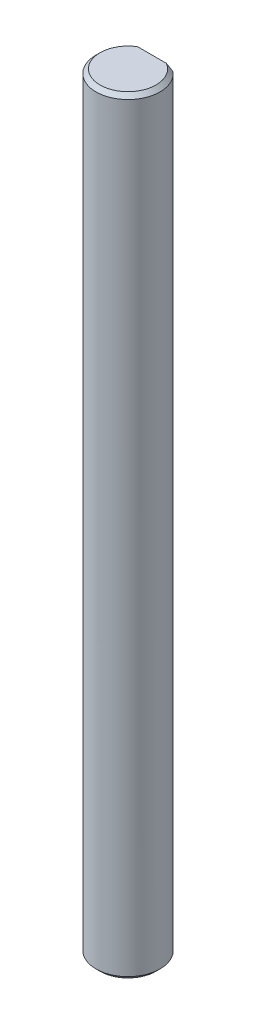
ISO-10303-21;
HEADER;
FILE_DESCRIPTION(('STEP AP214'),'2;1');
FILE_NAME('part.step','',(''),(''),'','','');
FILE_SCHEMA(('AUTOMOTIVE_DESIGN { 1 0 10303 214 1 1 1 1 }'));
ENDSEC;
DATA;
#1=APPLICATION_CONTEXT('core data for automotive mechanical design processes');
#2=APPLICATION_PROTOCOL_DEFINITION('international standard','automotive_design',2000,#1);
#3=PRODUCT_CONTEXT('',#1,'mechanical');
#4=PRODUCT('Part','Part','',(#3));
#5=PRODUCT_RELATED_PRODUCT_CATEGORY('part','',(#4));
#6=PRODUCT_DEFINITION_FORMATION('','',#4);
#7=PRODUCT_DEFINITION_CONTEXT('part definition',#1,'design');
#8=PRODUCT_DEFINITION('design','',#6,#7);
#9=PRODUCT_DEFINITION_SHAPE('','',#8);
#10=(LENGTH_UNIT() NAMED_UNIT(*) SI_UNIT(.MILLI.,.METRE.));
#11=(NAMED_UNIT(*) PLANE_ANGLE_UNIT() SI_UNIT($,.RADIAN.));
#12=(NAMED_UNIT(*) SI_UNIT($,.STERADIAN.) SOLID_ANGLE_UNIT());
#13=UNCERTAINTY_MEASURE_WITH_UNIT(LENGTH_MEASURE(1.E-05),#10,'distance_accuracy_value','');
#14=(GEOMETRIC_REPRESENTATION_CONTEXT(3) GLOBAL_UNCERTAINTY_ASSIGNED_CONTEXT((#13)) GLOBAL_UNIT_ASSIGNED_CONTEXT((#10,
#11,#12)) REPRESENTATION_CONTEXT('',''));
#15=CARTESIAN_POINT('',(0.,0.,0.));
#16=DIRECTION('',(0.,0.,1.));
#17=DIRECTION('',(1.,0.,0.));
#18=AXIS2_PLACEMENT_3D('',#15,#16,#17);
#19=CARTESIAN_POINT('',(0.,96.,0.));
#20=DIRECTION('',(0.,1.,0.));
#21=DIRECTION('',(0.,0.,1.));
#22=AXIS2_PLACEMENT_3D('',#19,#20,#21);
#23=PLANE('',#22);
#24=DIRECTION('',(1.,0.,0.));
#25=VECTOR('',#24,1.);
#26=CARTESIAN_POINT('',(0.,96.,-3.));
#27=LINE('',#26,#25);
#28=CARTESIAN_POINT('',(1.80277563783922,96.0000000000362,-3.));
#29=VERTEX_POINT('',#28);
#30=CARTESIAN_POINT('',(-1.80277563790592,96.0000000000018,-3.));
#31=VERTEX_POINT('',#30);
#32=EDGE_CURVE('E188',#29,#31,#27,.F.);
#33=ORIENTED_EDGE('',*,*,#32,.T.);
#34=CARTESIAN_POINT('',(0.,96.0000000000036,0.));
#35=DIRECTION('',(0.,-1.,0.));
#36=DIRECTION('',(1.,0.,0.));
#37=AXIS2_PLACEMENT_3D('',#34,#35,#36);
#38=CIRCLE('',#37,3.50000000008776);
#39=EDGE_CURVE('E149',#29,#31,#38,.T.);
#40=ORIENTED_EDGE('',*,*,#39,.F.);
#41=EDGE_LOOP('',(#33,#40));
#42=FACE_BOUND('',#41,.T.);
#43=ADVANCED_FACE('F17',(#42),#23,.T.);
#44=CARTESIAN_POINT('',(2.5,21.,-3.));
#45=DIRECTION('',(1.,0.,0.));
#46=DIRECTION('',(0.,0.,-1.));
#47=AXIS2_PLACEMENT_3D('',#44,#45,#46);
#48=PLANE('',#47);
#49=DIRECTION('',(0.,1.,0.));
#50=VECTOR('',#49,1.);
#51=CARTESIAN_POINT('',(2.5,21.,-3.));
#52=LINE('',#51,#50);
#53=CARTESIAN_POINT('',(2.50000000000947,0.405124837925426,-3.00000000001008));
#54=VERTEX_POINT('',#53);
#55=CARTESIAN_POINT('',(2.5,21.,-3.));
#56=VERTEX_POINT('',#55);
#57=EDGE_CURVE('E84',#54,#56,#52,.T.);
#58=ORIENTED_EDGE('',*,*,#57,.T.);
#59=DIRECTION('',(0.,0.,-1.));
#60=VECTOR('',#59,1.);
#61=CARTESIAN_POINT('',(2.5,21.,-3.));
#62=LINE('',#61,#60);
#63=CARTESIAN_POINT('',(2.5,21.,-3.1224989991992));
#64=VERTEX_POINT('',#63);
#65=EDGE_CURVE('E89',#64,#56,#62,.F.);
#66=ORIENTED_EDGE('',*,*,#65,.F.);
#67=DIRECTION('',(0.,-1.,0.));
#68=VECTOR('',#67,1.);
#69=CARTESIAN_POINT('',(2.5,96.,-3.1224989991992));
#70=LINE('',#69,#68);
#71=CARTESIAN_POINT('',(2.5,0.499999999990403,-3.1224989992067));
#72=VERTEX_POINT('',#71);
#73=EDGE_CURVE('E87',#72,#64,#70,.F.);
#74=ORIENTED_EDGE('',*,*,#73,.F.);
#75=CARTESIAN_POINT('',(2.5,0.405124837927105,-3.00000000002016));
#76=CARTESIAN_POINT('',(2.5,0.420858232889406,-3.02047778892625));
#77=CARTESIAN_POINT('',(2.5,0.436631194233203,-3.04092493377091));
#78=CARTESIAN_POINT('',(2.5,0.468256248258232,-3.08175793349673));
#79=CARTESIAN_POINT('',(2.5,0.484108340932331,-3.10214378838342));
#80=CARTESIAN_POINT('',(2.5,0.499999999980791,-3.1224989992142));
#81=B_SPLINE_CURVE_WITH_KNOTS('',3,(#75,#76,#77,#78,#79,#80),.UNSPECIFIED.,.F.,.F.,(4,2,4),(0.,
0.0774715972254449,0.154943187466547),.UNSPECIFIED.);
#82=EDGE_CURVE('E20',#54,#72,#81,.T.);
#83=ORIENTED_EDGE('',*,*,#82,.F.);
#84=EDGE_LOOP('',(#58,#66,#74,#83));
#85=FACE_BOUND('',#84,.T.);
#86=ADVANCED_FACE('F81',(#85),#48,.F.);
#87=CARTESIAN_POINT('',(-2.5,21.,-3.));
#88=DIRECTION('',(0.,0.,1.));
#89=DIRECTION('',(1.,0.,0.));
#90=AXIS2_PLACEMENT_3D('',#87,#88,#89);
#91=PLANE('',#90);
#92=DIRECTION('',(1.,0.,0.));
#93=VECTOR('',#92,1.);
#94=CARTESIAN_POINT('',(0.,0.,-3.));
#95=LINE('',#94,#93);
#96=CARTESIAN_POINT('',(1.80277563783862,-3.28457455383862E-11,-3.));
#97=VERTEX_POINT('',#96);
#98=CARTESIAN_POINT('',(-1.80277563783862,-3.28458455436605E-11,-3.));
#99=VERTEX_POINT('',#98);
#100=EDGE_CURVE('E98',#97,#99,#95,.F.);
#101=ORIENTED_EDGE('',*,*,#100,.T.);
#102=CARTESIAN_POINT('',(-2.5000000348508,0.405124847572636,-3.00000001958216));
#103=CARTESIAN_POINT('',(-2.44337206247022,0.368876916122266,-3.00000000706963));
#104=CARTESIAN_POINT('',(-2.38641513585717,0.333136548722232,-3.0000000019029));
#105=CARTESIAN_POINT('',(-2.27181042214399,0.26285353526736,-2.99999999809814));
#106=CARTESIAN_POINT('',(-2.21416302825434,0.228310247418162,-2.99999999945657));
#107=CARTESIAN_POINT('',(-2.09807747587407,0.160560990014678,-3.00000000054348));
#108=CARTESIAN_POINT('',(-2.03963924429478,0.127355145209297,-3.00000000027181));
#109=CARTESIAN_POINT('',(-1.92187925818233,0.062473006645769,-2.99999999972804));
#110=CARTESIAN_POINT('',(-1.86255703916131,0.0307975569775499,-2.99999999945593));
#111=CARTESIAN_POINT('',(-1.80277563777516,-6.55353125076226E-11,-3.));
#112=B_SPLINE_CURVE_WITH_KNOTS('',3,(#102,#103,#104,#105,#106,#107,#108,#109,#110,#111),
.UNSPECIFIED.,.F.,.F.,(4,2,2,2,4),(0.,0.201709286514318,0.403308702042758,0.604926878250095,
0.806655016410291),.UNSPECIFIED.);
#113=CARTESIAN_POINT('',(-2.50000001455334,0.405124847228437,-3.));
#114=VERTEX_POINT('',#113);
#115=EDGE_CURVE('E99',#114,#99,#112,.T.);
#116=ORIENTED_EDGE('',*,*,#115,.F.);
#117=DIRECTION('',(0.,1.,0.));
#118=VECTOR('',#117,1.);
#119=CARTESIAN_POINT('',(-2.5,21.,-3.));
#120=LINE('',#119,#118);
#121=CARTESIAN_POINT('',(-2.5,21.,-3.));
#122=VERTEX_POINT('',#121);
#123=EDGE_CURVE('E180',#114,#122,#120,.T.);
#124=ORIENTED_EDGE('',*,*,#123,.T.);
#125=DIRECTION('',(1.,0.,0.));
#126=VECTOR('',#125,1.);
#127=CARTESIAN_POINT('',(0.,21.,-3.));
#128=LINE('',#127,#126);
#129=EDGE_CURVE('E104',#56,#122,#128,.F.);
#130=ORIENTED_EDGE('',*,*,#129,.F.);
#131=ORIENTED_EDGE('',*,*,#57,.F.);
#132=CARTESIAN_POINT('',(1.80277563777319,-6.24624671837794E-11,-2.99999999999266));
#133=CARTESIAN_POINT('',(1.86255703674264,0.0307975554004895,-2.99999999999735));
#134=CARTESIAN_POINT('',(1.92187925315005,0.0624730037913465,-2.99999999999929));
#135=CARTESIAN_POINT('',(2.03963923407312,0.127355139658872,-3.00000000000071));
#136=CARTESIAN_POINT('',(2.09807746307711,0.160560983044794,-3.0000000000002));
#137=CARTESIAN_POINT('',(2.21416301089205,0.228310236786748,-2.99999999999979));
#138=CARTESIAN_POINT('',(2.27181040279095,0.262853522395128,-2.9999999999999));
#139=CARTESIAN_POINT('',(2.3864151107184,0.333136534310609,-3.0000000000001));
#140=CARTESIAN_POINT('',(2.4433720335351,0.368876902414242,-3.0000000000002));
#141=CARTESIAN_POINT('',(2.50000000001895,0.405124837923747,-3.));
#142=B_SPLINE_CURVE_WITH_KNOTS('',3,(#132,#133,#134,#135,#136,#137,#138,#139,#140,#141),
.UNSPECIFIED.,.F.,.F.,(4,2,2,2,4),(0.,0.201728129471647,0.403346296879743,0.604945703786695,
0.806654981773943),.UNSPECIFIED.);
#143=EDGE_CURVE('E91',#97,#54,#142,.T.);
#144=ORIENTED_EDGE('',*,*,#143,.F.);
#145=EDGE_LOOP('',(#101,#116,#124,#130,#131,#144));
#146=FACE_BOUND('',#145,.T.);
#147=ADVANCED_FACE('F101',(#146),#91,.F.);
#148=CARTESIAN_POINT('',(0.,0.,0.));
#149=DIRECTION('',(0.,1.,0.));
#150=DIRECTION('',(0.,0.,1.));
#151=AXIS2_PLACEMENT_3D('',#148,#149,#150);
#152=PLANE('',#151);
#153=CARTESIAN_POINT('',(0.,0.,0.));
#154=DIRECTION('',(0.,1.,0.));
#155=DIRECTION('',(0.,0.,1.));
#156=AXIS2_PLACEMENT_3D('',#153,#154,#155);
#157=CIRCLE('',#156,3.50000000008777);
#158=EDGE_CURVE('E94',#99,#97,#157,.T.);
#159=ORIENTED_EDGE('',*,*,#158,.F.);
#160=ORIENTED_EDGE('',*,*,#100,.F.);
#161=EDGE_LOOP('',(#159,#160));
#162=FACE_BOUND('',#161,.T.);
#163=ADVANCED_FACE('F157',(#162),#152,.F.);
#164=CARTESIAN_POINT('',(0.,95.5000000000723,0.));
#165=DIRECTION('',(0.,-1.,0.));
#166=DIRECTION('',(1.,0.,0.));
#167=AXIS2_PLACEMENT_3D('',#164,#165,#166);
#168=CONICAL_SURFACE('',#167,4.0000000000191,0.785398163397448);
#169=CARTESIAN_POINT('',(2.64575131110063,95.5000000000543,-2.99999999998005));
#170=CARTESIAN_POINT('',(2.5775756819294,95.5450850700312,-2.9999999999928));
#171=CARTESIAN_POINT('',(2.50895192116397,95.5895037685869,-2.99999999999806));
#172=CARTESIAN_POINT('',(2.37074655287053,95.6767094992841,-3.00000000000194));
#173=CARTESIAN_POINT('',(2.30116567951909,95.7194976964701,-3.00000000000055));
#174=CARTESIAN_POINT('',(2.16087490209965,95.8032162886291,-2.99999999999945));
#175=CARTESIAN_POINT('',(2.09016482902046,95.8441464019056,-2.99999999999972));
#176=CARTESIAN_POINT('',(1.94745530523873,95.9238154085384,-3.00000000000028));
#177=CARTESIAN_POINT('',(1.87545495102455,95.9625526805922,-3.00000000000055));
#178=CARTESIAN_POINT('',(1.80277563777644,96.0000000000685,-3.));
#179=B_SPLINE_CURVE_WITH_KNOTS('',3,(#169,#170,#171,#172,#173,#174,#175,#176,#177,#178),
.UNSPECIFIED.,.F.,.F.,(4,2,2,2,4),(0.,0.245209378122687,0.490240129158022,0.735307905061427,
0.980554569568941),.UNSPECIFIED.);
#180=CARTESIAN_POINT('',(2.64575131108566,95.5000000000317,-3.));
#181=VERTEX_POINT('',#180);
#182=EDGE_CURVE('E190',#181,#29,#179,.T.);
#183=ORIENTED_EDGE('',*,*,#182,.T.);
#184=ORIENTED_EDGE('',*,*,#39,.T.);
#185=CARTESIAN_POINT('',(-1.80277563777426,96.0000000000652,-2.99999999999204));
#186=CARTESIAN_POINT('',(-1.87545495102336,95.9625526805909,-2.99999999999713));
#187=CARTESIAN_POINT('',(-1.94745530523809,95.9238154085381,-2.99999999999923));
#188=CARTESIAN_POINT('',(-2.09016482902031,95.8441464019064,-3.00000000000077));
#189=CARTESIAN_POINT('',(-2.16087490209944,95.8032162886297,-3.00000000000022));
#190=CARTESIAN_POINT('',(-2.30116567951836,95.7194976964701,-2.99999999999978));
#191=CARTESIAN_POINT('',(-2.37074655286933,95.6767094992835,-2.99999999999989));
#192=CARTESIAN_POINT('',(-2.5089519211638,95.5895037685884,-3.00000000000011));
#193=CARTESIAN_POINT('',(-2.57757568193073,95.5450850700353,-3.00000000000022));
#194=CARTESIAN_POINT('',(-2.64575131110564,95.5000000000643,-3.));
#195=B_SPLINE_CURVE_WITH_KNOTS('',3,(#185,#186,#187,#188,#189,#190,#191,#192,#193,#194),
.UNSPECIFIED.,.F.,.F.,(4,2,2,2,4),(0.,0.245246664507408,0.49031444041079,0.735345191445805,
0.980554569568107),.UNSPECIFIED.);
#196=CARTESIAN_POINT('',(-2.64575131108562,95.5000000000318,-3.));
#197=VERTEX_POINT('',#196);
#198=EDGE_CURVE('E185',#31,#197,#195,.T.);
#199=ORIENTED_EDGE('',*,*,#198,.T.);
#200=CARTESIAN_POINT('',(0.,95.5,0.));
#201=DIRECTION('',(0.,-1.,0.));
#202=DIRECTION('',(0.,0.,-1.));
#203=AXIS2_PLACEMENT_3D('',#200,#201,#202);
#204=CIRCLE('',#203,4.);
#205=EDGE_CURVE('E132',#181,#197,#204,.T.);
#206=ORIENTED_EDGE('',*,*,#205,.F.);
#207=EDGE_LOOP('',(#183,#184,#199,#206));
#208=FACE_BOUND('',#207,.T.);
#209=ADVANCED_FACE('F204',(#208),#168,.T.);
#210=CARTESIAN_POINT('',(0.,56.,-3.));
#211=DIRECTION('',(0.,0.,1.));
#212=DIRECTION('',(1.,0.,0.));
#213=AXIS2_PLACEMENT_3D('',#210,#211,#212);
#214=PLANE('',#213);
#215=ORIENTED_EDGE('',*,*,#32,.F.);
#216=ORIENTED_EDGE('',*,*,#182,.F.);
#217=DIRECTION('',(0.,-1.,0.));
#218=VECTOR('',#217,1.);
#219=CARTESIAN_POINT('',(2.64575131106459,96.,-3.));
#220=LINE('',#219,#218);
#221=CARTESIAN_POINT('',(2.64575131106459,56.,-3.));
#222=VERTEX_POINT('',#221);
#223=EDGE_CURVE('E113',#222,#181,#220,.F.);
#224=ORIENTED_EDGE('',*,*,#223,.F.);
#225=DIRECTION('',(1.,0.,0.));
#226=VECTOR('',#225,1.);
#227=CARTESIAN_POINT('',(0.,56.,-3.));
#228=LINE('',#227,#226);
#229=CARTESIAN_POINT('',(-2.64575131106459,56.,-3.));
#230=VERTEX_POINT('',#229);
#231=EDGE_CURVE('E114',#230,#222,#228,.T.);
#232=ORIENTED_EDGE('',*,*,#231,.F.);
#233=DIRECTION('',(0.,-1.,0.));
#234=VECTOR('',#233,1.);
#235=CARTESIAN_POINT('',(-2.64575131106459,96.,-3.));
#236=LINE('',#235,#234);
#237=EDGE_CURVE('E126',#197,#230,#236,.T.);
#238=ORIENTED_EDGE('',*,*,#237,.F.);
#239=ORIENTED_EDGE('',*,*,#198,.F.);
#240=EDGE_LOOP('',(#215,#216,#224,#232,#238,#239));
#241=FACE_BOUND('',#240,.T.);
#242=ADVANCED_FACE('F208',(#241),#214,.F.);
#243=CARTESIAN_POINT('',(0.,56.,0.));
#244=DIRECTION('',(0.,1.,0.));
#245=DIRECTION('',(0.,0.,1.));
#246=AXIS2_PLACEMENT_3D('',#243,#244,#245);
#247=PLANE('',#246);
#248=CARTESIAN_POINT('',(0.,56.,0.));
#249=DIRECTION('',(0.,-1.,0.));
#250=DIRECTION('',(0.,0.,-1.));
#251=AXIS2_PLACEMENT_3D('',#248,#249,#250);
#252=CIRCLE('',#251,4.);
#253=EDGE_CURVE('E124',#230,#222,#252,.T.);
#254=ORIENTED_EDGE('',*,*,#253,.F.);
#255=ORIENTED_EDGE('',*,*,#231,.T.);
#256=EDGE_LOOP('',(#254,#255));
#257=FACE_BOUND('',#256,.T.);
#258=ADVANCED_FACE('F213',(#257),#247,.T.);
#259=CARTESIAN_POINT('',(0.,21.,0.));
#260=DIRECTION('',(0.,-1.,0.));
#261=DIRECTION('',(0.,0.,-1.));
#262=AXIS2_PLACEMENT_3D('',#259,#260,#261);
#263=PLANE('',#262);
#264=ORIENTED_EDGE('',*,*,#129,.T.);
#265=DIRECTION('',(0.,0.,1.));
#266=VECTOR('',#265,1.);
#267=CARTESIAN_POINT('',(-2.5,21.,-3.));
#268=LINE('',#267,#266);
#269=CARTESIAN_POINT('',(-2.5,21.,-3.1224989991992));
#270=VERTEX_POINT('',#269);
#271=EDGE_CURVE('E178',#122,#270,#268,.F.);
#272=ORIENTED_EDGE('',*,*,#271,.T.);
#273=CARTESIAN_POINT('',(0.,21.,0.));
#274=DIRECTION('',(0.,-1.,0.));
#275=DIRECTION('',(0.,0.,-1.));
#276=AXIS2_PLACEMENT_3D('',#273,#274,#275);
#277=CIRCLE('',#276,4.);
#278=EDGE_CURVE('E121',#64,#270,#277,.F.);
#279=ORIENTED_EDGE('',*,*,#278,.F.);
#280=ORIENTED_EDGE('',*,*,#65,.T.);
#281=EDGE_LOOP('',(#264,#272,#279,#280));
#282=FACE_BOUND('',#281,.T.);
#283=ADVANCED_FACE('F200',(#282),#263,.T.);
#284=CARTESIAN_POINT('',(-2.5,21.,-3.));
#285=DIRECTION('',(-1.,0.,0.));
#286=DIRECTION('',(0.,0.,1.));
#287=AXIS2_PLACEMENT_3D('',#284,#285,#286);
#288=PLANE('',#287);
#289=ORIENTED_EDGE('',*,*,#123,.F.);
#290=CARTESIAN_POINT('',(-2.5,0.499999999981886,-3.12249899921561));
#291=CARTESIAN_POINT('',(-2.5,0.484108349316188,-3.1021437991195));
#292=CARTESIAN_POINT('',(-2.5,0.468256264982105,-3.08175795500045));
#293=CARTESIAN_POINT('',(-2.5,0.436631227551613,-3.04092497687589));
#294=CARTESIAN_POINT('',(-2.5,0.420858274462339,-3.02047784286483));
#295=CARTESIAN_POINT('',(-2.5,0.405124887711813,-3.00000006482533));
#296=B_SPLINE_CURVE_WITH_KNOTS('',3,(#290,#291,#292,#293,#294,#295),.UNSPECIFIED.,.F.,.F.,(4,2,
4),(0.,0.0774715493818697,0.154943105748066),.UNSPECIFIED.);
#297=CARTESIAN_POINT('',(-2.5,0.49999999999095,-3.1224989992074));
#298=VERTEX_POINT('',#297);
#299=EDGE_CURVE('E39',#298,#114,#296,.T.);
#300=ORIENTED_EDGE('',*,*,#299,.F.);
#301=DIRECTION('',(0.,-1.,0.));
#302=VECTOR('',#301,1.);
#303=CARTESIAN_POINT('',(-2.5,96.,-3.1224989991992));
#304=LINE('',#303,#302);
#305=EDGE_CURVE('E30',#270,#298,#304,.T.);
#306=ORIENTED_EDGE('',*,*,#305,.F.);
#307=ORIENTED_EDGE('',*,*,#271,.F.);
#308=EDGE_LOOP('',(#289,#300,#306,#307));
#309=FACE_BOUND('',#308,.T.);
#310=ADVANCED_FACE('F134',(#309),#288,.F.);
#311=CARTESIAN_POINT('',(0.,0.499999999931333,0.));
#312=DIRECTION('',(0.,1.,0.));
#313=DIRECTION('',(0.,0.,1.));
#314=AXIS2_PLACEMENT_3D('',#311,#312,#313);
#315=CONICAL_SURFACE('',#314,3.99999999996226,0.785398163340605);
#316=ORIENTED_EDGE('',*,*,#299,.T.);
#317=ORIENTED_EDGE('',*,*,#115,.T.);
#318=ORIENTED_EDGE('',*,*,#158,.T.);
#319=ORIENTED_EDGE('',*,*,#143,.T.);
#320=ORIENTED_EDGE('',*,*,#82,.T.);
#321=CARTESIAN_POINT('',(0.,0.500000000000014,0.));
#322=DIRECTION('',(0.,-1.,0.));
#323=DIRECTION('',(0.,0.,-1.));
#324=AXIS2_PLACEMENT_3D('',#321,#322,#323);
#325=CIRCLE('',#324,4.);
#326=EDGE_CURVE('E10',#298,#72,#325,.F.);
#327=ORIENTED_EDGE('',*,*,#326,.F.);
#328=EDGE_LOOP('',(#316,#317,#318,#319,#320,#327));
#329=FACE_BOUND('',#328,.T.);
#330=ADVANCED_FACE('F92',(#329),#315,.T.);
#331=CARTESIAN_POINT('',(0.,96.,0.));
#332=DIRECTION('',(0.,-1.,0.));
#333=DIRECTION('',(0.,0.,-1.));
#334=AXIS2_PLACEMENT_3D('',#331,#332,#333);
#335=CYLINDRICAL_SURFACE('',#334,4.);
#336=ORIENTED_EDGE('',*,*,#223,.T.);
#337=ORIENTED_EDGE('',*,*,#205,.T.);
#338=ORIENTED_EDGE('',*,*,#237,.T.);
#339=ORIENTED_EDGE('',*,*,#253,.T.);
#340=EDGE_LOOP('',(#336,#337,#338,#339));
#341=FACE_BOUND('',#340,.T.);
#342=ORIENTED_EDGE('',*,*,#305,.T.);
#343=ORIENTED_EDGE('',*,*,#326,.T.);
#344=ORIENTED_EDGE('',*,*,#73,.T.);
#345=ORIENTED_EDGE('',*,*,#278,.T.);
#346=EDGE_LOOP('',(#342,#343,#344,#345));
#347=FACE_BOUND('',#346,.T.);
#348=ADVANCED_FACE('F140',(#341,#347),#335,.T.);
#349=CLOSED_SHELL('',(#43,#86,#147,#163,#209,#242,#258,#283,#310,#330,#348));
#350=MANIFOLD_SOLID_BREP('B1',#349);
#351=ADVANCED_BREP_SHAPE_REPRESENTATION('',(#18,#350),#14);
#352=SHAPE_DEFINITION_REPRESENTATION(#9,#351);
ENDSEC;
END-ISO-10303-21;
